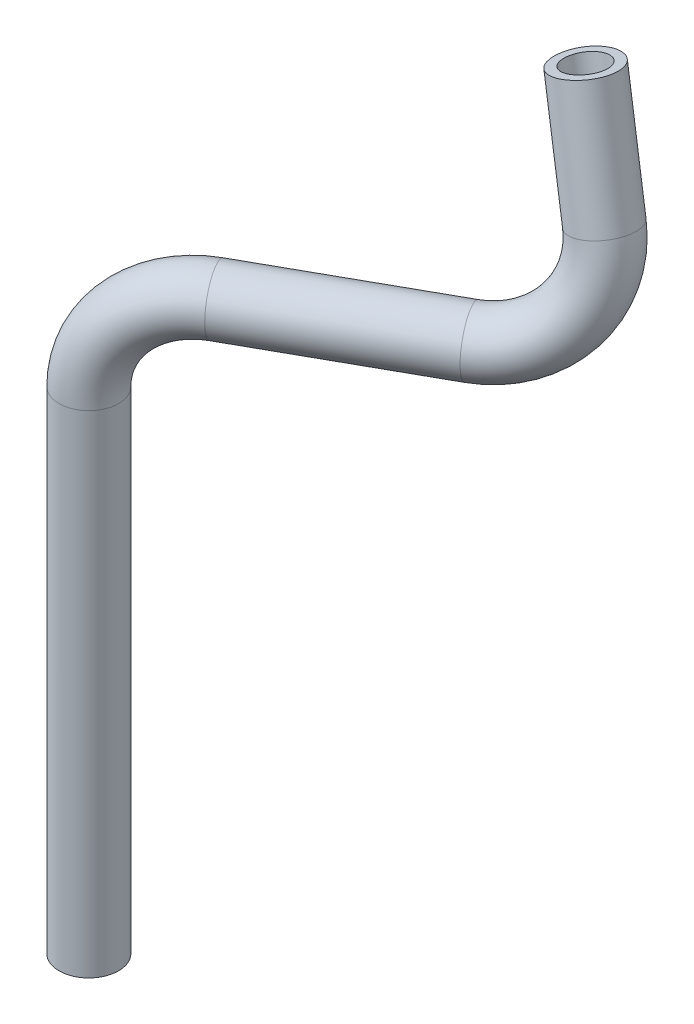
ISO-10303-21;
HEADER;
FILE_DESCRIPTION(('STEP AP214'),'2;1');
FILE_NAME('part.step','',(''),(''),'','','');
FILE_SCHEMA(('AUTOMOTIVE_DESIGN { 1 0 10303 214 1 1 1 1 }'));
ENDSEC;
DATA;
#1=APPLICATION_CONTEXT('core data for automotive mechanical design processes');
#2=APPLICATION_PROTOCOL_DEFINITION('international standard','automotive_design',2000,#1);
#3=PRODUCT_CONTEXT('',#1,'mechanical');
#4=PRODUCT('Part','Part','',(#3));
#5=PRODUCT_RELATED_PRODUCT_CATEGORY('part','',(#4));
#6=PRODUCT_DEFINITION_FORMATION('','',#4);
#7=PRODUCT_DEFINITION_CONTEXT('part definition',#1,'design');
#8=PRODUCT_DEFINITION('design','',#6,#7);
#9=PRODUCT_DEFINITION_SHAPE('','',#8);
#10=(LENGTH_UNIT() NAMED_UNIT(*) SI_UNIT(.MILLI.,.METRE.));
#11=(NAMED_UNIT(*) PLANE_ANGLE_UNIT() SI_UNIT($,.RADIAN.));
#12=(NAMED_UNIT(*) SI_UNIT($,.STERADIAN.) SOLID_ANGLE_UNIT());
#13=UNCERTAINTY_MEASURE_WITH_UNIT(LENGTH_MEASURE(1.E-05),#10,'distance_accuracy_value','');
#14=(GEOMETRIC_REPRESENTATION_CONTEXT(3) GLOBAL_UNCERTAINTY_ASSIGNED_CONTEXT((#13)) GLOBAL_UNIT_ASSIGNED_CONTEXT((#10,
#11,#12)) REPRESENTATION_CONTEXT('',''));
#15=CARTESIAN_POINT('',(0.,0.,0.));
#16=DIRECTION('',(0.,0.,1.));
#17=DIRECTION('',(1.,0.,0.));
#18=AXIS2_PLACEMENT_3D('',#15,#16,#17);
#19=CARTESIAN_POINT('',(-2.22044604925031E-13,0.,0.));
#20=DIRECTION('',(0.,-1.,0.));
#21=DIRECTION('',(0.981862774250405,0.,0.189592965431999));
#22=AXIS2_PLACEMENT_3D('',#19,#20,#21);
#23=PLANE('',#22);
#24=CARTESIAN_POINT('',(-2.19537750383587E-13,0.,0.));
#25=DIRECTION('',(0.,-1.,0.));
#26=DIRECTION('',(0.,0.,-1.));
#27=AXIS2_PLACEMENT_3D('',#24,#25,#26);
#28=CIRCLE('',#27,2.175);
#29=CARTESIAN_POINT('',(-2.19537750383587E-13,0.,-2.17500000000001));
#30=VERTEX_POINT('',#29);
#31=EDGE_CURVE('E67',#30,#30,#28,.T.);
#32=ORIENTED_EDGE('',*,*,#31,.F.);
#33=EDGE_LOOP('',(#32));
#34=FACE_BOUND('',#33,.T.);
#35=CARTESIAN_POINT('',(-2.22044604925031E-13,0.,0.));
#36=DIRECTION('',(0.,-1.,0.));
#37=DIRECTION('',(0.981862774250405,0.,0.189592965431999));
#38=AXIS2_PLACEMENT_3D('',#35,#36,#37);
#39=CIRCLE('',#38,3.175);
#40=CARTESIAN_POINT('',(3.11741430824481,0.,0.60195766524659));
#41=VERTEX_POINT('',#40);
#42=EDGE_CURVE('E11',#41,#41,#39,.T.);
#43=ORIENTED_EDGE('',*,*,#42,.T.);
#44=EDGE_LOOP('',(#43));
#45=FACE_BOUND('',#44,.T.);
#46=ADVANCED_FACE('F45',(#34,#45),#23,.T.);
#47=CARTESIAN_POINT('',(32.0912843493026,81.9487271445281,-21.7300962858045));
#48=DIRECTION('',(0.219779218999893,-0.973167297783081,0.0681359334079606));
#49=DIRECTION('',(0.97543416101534,0.220291165334198,0.));
#50=AXIS2_PLACEMENT_3D('',#47,#48,#49);
#51=CYLINDRICAL_SURFACE('',#50,3.175);
#52=CARTESIAN_POINT('',(33.9076141098866,73.9061436235111,-21.1669978992636));
#53=DIRECTION('',(0.219779218999892,-0.973167297783081,0.0681359334079604));
#54=DIRECTION('',(0.975434161015341,0.220291165334197,0.));
#55=AXIS2_PLACEMENT_3D('',#52,#53,#54);
#56=CIRCLE('',#55,3.175);
#57=CARTESIAN_POINT('',(36.6033566039685,74.4027721533916,-22.7691706455398));
#58=VERTEX_POINT('',#57);
#59=EDGE_CURVE('E64',#58,#58,#56,.T.);
#60=ORIENTED_EDGE('',*,*,#59,.F.);
#61=EDGE_LOOP('',(#60));
#62=FACE_BOUND('',#61,.T.);
#63=CARTESIAN_POINT('',(34.0945263593937,87.4912522327395,-22.0691841110215));
#64=CARTESIAN_POINT('',(34.0911567873665,87.5061368556718,-21.8914286797788));
#65=CARTESIAN_POINT('',(34.0729976379843,87.5181099839496,-21.7135811977549));
#66=CARTESIAN_POINT('',(34.0076185561973,87.5355846065078,-21.3628317135187));
#67=CARTESIAN_POINT('',(33.9603639538796,87.541078357209,-21.1899358692418));
#68=CARTESIAN_POINT('',(33.8382169119769,87.5450954957041,-20.8541886776084));
#69=CARTESIAN_POINT('',(33.7633376723639,87.5436222086136,-20.6913325762344));
#70=CARTESIAN_POINT('',(33.5881513488829,87.5334306219162,-20.3802315851133));
#71=CARTESIAN_POINT('',(33.4878505691276,87.5247141172856,-20.231983085567));
#72=CARTESIAN_POINT('',(33.2647101434814,87.5000001530473,-19.9542264063674));
#73=CARTESIAN_POINT('',(33.1418693084137,87.4840023092221,-19.8247192161205));
#74=CARTESIAN_POINT('',(32.8771800023946,87.4449636811502,-19.5881213152766));
#75=CARTESIAN_POINT('',(32.7353309018781,87.421922663597,-19.4810313474527));
#76=CARTESIAN_POINT('',(32.4368169043125,87.3693556284119,-19.2923967078863));
#77=CARTESIAN_POINT('',(32.2801648971161,87.3398352237047,-19.2108300733831));
#78=CARTESIAN_POINT('',(31.9563955943367,87.2751249735461,-19.0754339274941));
#79=CARTESIAN_POINT('',(31.7892783456866,87.2399351535188,-19.0216042917279));
#80=CARTESIAN_POINT('',(31.449368484408,87.1649974125386,-18.9432280720498));
#81=CARTESIAN_POINT('',(31.2765780404005,87.1252512191454,-18.9186704295822));
#82=CARTESIAN_POINT('',(30.9301161569372,87.0425119867048,-18.8995034609477));
#83=CARTESIAN_POINT('',(30.7564447149706,86.9995189383992,-18.9048942201798));
#84=CARTESIAN_POINT('',(30.4129588913699,86.9117439957815,-18.9454974443186));
#85=CARTESIAN_POINT('',(30.2431472000222,86.8669609103549,-18.9807300921008));
#86=CARTESIAN_POINT('',(29.9122374776483,86.7772174943603,-19.0800648942893));
#87=CARTESIAN_POINT('',(29.75113949597,86.7322571627902,-19.1441672121726));
#88=CARTESIAN_POINT('',(29.4420390671831,86.6437283404495,-19.2995041188733));
#89=CARTESIAN_POINT('',(29.2940455831864,86.6001608151367,-19.3907570947961));
#90=CARTESIAN_POINT('',(29.0154104278531,86.5159863638337,-19.5978168401361));
#91=CARTESIAN_POINT('',(28.8847687032362,86.4753794287529,-19.7136235341556));
#92=CARTESIAN_POINT('',(28.6445431507196,86.3985345038414,-19.9664764234685));
#93=CARTESIAN_POINT('',(28.5349513834088,86.3622948687256,-20.1035145755225));
#94=CARTESIAN_POINT('',(28.3398499519176,86.2953494807288,-20.3949815956667));
#95=CARTESIAN_POINT('',(28.254340151575,86.2646436965593,-20.5494103654216));
#96=CARTESIAN_POINT('',(28.109886914459,86.2097095868623,-20.8711337792574));
#97=CARTESIAN_POINT('',(28.0509210534696,86.1854758008832,-21.0384174231775));
#98=CARTESIAN_POINT('',(27.9611352339654,86.144075237742,-21.3812099074512));
#99=CARTESIAN_POINT('',(27.9303152781044,86.1269084612462,-21.5567187485802));
#100=CARTESIAN_POINT('',(27.8977266838811,86.0999608957495,-21.910971206494));
#101=CARTESIAN_POINT('',(27.8959582532913,86.090180159573,-22.0897148464044));
#102=CARTESIAN_POINT('',(27.9215723920781,86.0780298015938,-22.4453559313768));
#103=CARTESIAN_POINT('',(27.948955131892,86.0756602231221,-22.6222533656386));
#104=CARTESIAN_POINT('',(28.0321970622588,86.0780934360554,-22.9693242617059));
#105=CARTESIAN_POINT('',(28.088080421601,86.0829023215446,-23.139491884381));
#106=CARTESIAN_POINT('',(28.2268276460043,86.0992397307249,-23.4681016855955));
#107=CARTESIAN_POINT('',(28.309691573595,86.1107682699894,-23.6265438369593));
#108=CARTESIAN_POINT('',(28.5001615767067,86.1399127666608,-23.927244802472));
#109=CARTESIAN_POINT('',(28.6077767032574,86.1575309521202,-24.0694976680002));
#110=CARTESIAN_POINT('',(28.844741685099,86.1980936423351,-24.3336911344503));
#111=CARTESIAN_POINT('',(28.9740914455361,86.2210381238458,-24.4556318240136));
#112=CARTESIAN_POINT('',(29.2507986060057,86.2714037173712,-24.6756411964378));
#113=CARTESIAN_POINT('',(29.3981435776896,86.2988217440905,-24.7737262166679));
#114=CARTESIAN_POINT('',(29.7067432347042,86.3572862766192,-24.943335943105));
#115=CARTESIAN_POINT('',(29.8679978428198,86.3883327622867,-25.0148607967411));
#116=CARTESIAN_POINT('',(30.1997145448838,86.4531787208199,-25.129282402073));
#117=CARTESIAN_POINT('',(30.3701704161291,86.4869763407929,-25.1721982458698));
#118=CARTESIAN_POINT('',(30.7155216150152,86.5565182465114,-25.2282762910284));
#119=CARTESIAN_POINT('',(30.8904169627229,86.592262541057,-25.2414383578752));
#120=CARTESIAN_POINT('',(31.2397084103149,86.6649243164607,-25.2376581183166));
#121=CARTESIAN_POINT('',(31.4141042885079,86.7018422501148,-25.2207040510596));
#122=CARTESIAN_POINT('',(31.7573262492633,86.7760840761416,-25.1571751831783));
#123=CARTESIAN_POINT('',(31.9261522892028,86.813407971618,-25.1106001559364));
#124=CARTESIAN_POINT('',(32.2535260156477,86.8877618437551,-24.9891189117273));
#125=CARTESIAN_POINT('',(32.4120647425889,86.9247915401996,-24.9141883769033));
#126=CARTESIAN_POINT('',(32.7141317762447,86.9977948864262,-24.7381460105728));
#127=CARTESIAN_POINT('',(32.8576606623454,87.033768576932,-24.6370351901605));
#128=CARTESIAN_POINT('',(33.1255594073866,87.1039176510492,-24.4115289331186));
#129=CARTESIAN_POINT('',(33.2499316449144,87.1380932575723,-24.287136391522));
#130=CARTESIAN_POINT('',(33.4759809491972,87.2038981270453,-24.0185623252401));
#131=CARTESIAN_POINT('',(33.5776526055916,87.2355267818195,-23.8743760962058));
#132=CARTESIAN_POINT('',(33.7553040455715,87.295428567885,-23.5704262311606));
#133=CARTESIAN_POINT('',(33.8312936595488,87.3237029803939,-23.4106685857045));
#134=CARTESIAN_POINT('',(33.9554053067559,87.3760901522151,-23.0801851259243));
#135=CARTESIAN_POINT('',(34.0035602450854,87.4002078017149,-22.9094725285944));
#136=CARTESIAN_POINT('',(34.0583527308327,87.4354983502445,-22.626280633167));
#137=CARTESIAN_POINT('',(34.0737574206657,87.4481606618429,-22.5156038680816));
#138=CARTESIAN_POINT('',(34.0929051982576,87.4713509246311,-22.2930249398219));
#139=CARTESIAN_POINT('',(34.0966482939903,87.4818788772802,-22.1811227774857));
#140=CARTESIAN_POINT('',(34.0945263593937,87.4912522327395,-22.0691841110215));
#141=B_SPLINE_CURVE_WITH_KNOTS('',3,(#63,#64,#65,#66,#67,#68,#69,#70,#71,#72,#73,#74,#75,#76,
#77,#78,#79,#80,#81,#82,#83,#84,#85,#86,#87,#88,#89,#90,#91,#92,#93,#94,#95,#96,#97,#98,#99,
#100,#101,#102,#103,#104,#105,#106,#107,#108,#109,#110,#111,#112,#113,#114,#115,#116,#117,#118,
#119,#120,#121,#122,#123,#124,#125,#126,#127,#128,#129,#130,#131,#132,#133,#134,#135,#136,#137,
#138,#139,#140),.UNSPECIFIED.,.T.,.F.,(4,2,2,2,2,2,2,2,2,2,2,2,2,2,2,2,2,2,2,2,2,2,2,2,2,2,2,2,
2,2,2,2,2,2,2,2,2,2,4),(0.,0.534818019808254,1.07027456121159,1.60547557433587,2.140543996283,
2.67564065569527,3.21075504221285,3.7454076898456,4.28005793992585,4.81450614242856,
5.34895586893202,5.88376734711921,6.41858185375935,6.95375937777974,7.48893525844452,
8.02390888877468,8.55887949424317,9.09339730657504,9.62791516930454,10.1624368548277,
10.6969616655406,11.2319405138155,11.7669206019524,12.3020966337715,12.8372703300483,
13.3720764782068,13.9068796577412,14.4413255804114,14.9757739192704,15.5104310149856,
16.04509220119,16.5802129590818,17.1153130534585,17.6503466534212,18.1855076352326,
18.7204635392651,19.2547857384364,19.5915791430271,19.9283723173331),.UNSPECIFIED.);
#142=CARTESIAN_POINT('',(34.0945263593937,87.4912522327395,-22.0691841110215));
#143=VERTEX_POINT('',#142);
#144=EDGE_CURVE('E90',#143,#143,#141,.T.);
#145=ORIENTED_EDGE('',*,*,#144,.T.);
#146=EDGE_LOOP('',(#145));
#147=FACE_BOUND('',#146,.T.);
#148=ADVANCED_FACE('F123',(#62,#147),#51,.T.);
#149=CARTESIAN_POINT('',(25.4170865694713,72.3419592774307,-16.1207845251656));
#150=DIRECTION('',(-0.480423267286548,-0.168756285335828,-0.860647895721224));
#151=DIRECTION('',(-0.873171082284387,0.,0.487413849887662));
#152=AXIS2_PLACEMENT_3D('',#149,#150,#151);
#153=TOROIDAL_SURFACE('',#152,10.,3.175);
#154=CARTESIAN_POINT('',(26.239628076754,62.4853811888664,-14.6472534420759));
#155=DIRECTION('',(-0.873171082284388,0.,0.487413849887661));
#156=DIRECTION('',(0.313953306155402,-0.764923944054147,0.562427489874687));
#157=AXIS2_PLACEMENT_3D('',#154,#155,#156);
#158=CIRCLE('',#157,3.175);
#159=CARTESIAN_POINT('',(26.5007850053163,59.3559176457473,-14.1794073231949));
#160=VERTEX_POINT('',#159);
#161=EDGE_CURVE('E59',#160,#160,#158,.T.);
#162=CARTESIAN_POINT('',(25.4170865694713,72.3419592774307,-16.1207845251656));
#163=DIRECTION('',(-0.480423267286548,-0.168756285335828,-0.860647895721224));
#164=DIRECTION('',(-0.873171082284387,0.,0.487413849887662));
#165=AXIS2_PLACEMENT_3D('',#162,#163,#164);
#166=CIRCLE('',#165,13.175);
#167=EDGE_CURVE('',#58,#160,#166,.T.);
#168=ORIENTED_EDGE('',*,*,#59,.T.);
#169=ORIENTED_EDGE('',*,*,#161,.F.);
#170=ORIENTED_EDGE('',*,*,#167,.T.);
#171=ORIENTED_EDGE('',*,*,#167,.F.);
#172=EDGE_LOOP('',(#168,#170,#169,#171));
#173=FACE_BOUND('',#172,.T.);
#174=ADVANCED_FACE('F126',(#173),#153,.T.);
#175=CARTESIAN_POINT('',(26.2396280767541,62.4853811888664,-14.6472534420759));
#176=DIRECTION('',(-0.873171082284387,0.,0.487413849887662));
#177=DIRECTION('',(0.487413849887662,0.,0.873171082284387));
#178=AXIS2_PLACEMENT_3D('',#175,#176,#177);
#179=CYLINDRICAL_SURFACE('',#178,3.175);
#180=CARTESIAN_POINT('',(8.73171082284388,62.4853811888664,-4.87413849887663));
#181=DIRECTION('',(-0.873171082284388,0.,0.487413849887661));
#182=DIRECTION('',(0.313953306155402,-0.764923944054147,0.562427489874687));
#183=AXIS2_PLACEMENT_3D('',#180,#181,#182);
#184=CIRCLE('',#183,3.175);
#185=CARTESIAN_POINT('',(8.73171082284389,65.6603811888664,-4.87413849887663));
#186=VERTEX_POINT('',#185);
#187=EDGE_CURVE('E55',#186,#186,#184,.T.);
#188=ORIENTED_EDGE('',*,*,#187,.F.);
#189=EDGE_LOOP('',(#188));
#190=FACE_BOUND('',#189,.T.);
#191=ORIENTED_EDGE('',*,*,#161,.T.);
#192=EDGE_LOOP('',(#191));
#193=FACE_BOUND('',#192,.T.);
#194=ADVANCED_FACE('F130',(#190,#193),#179,.T.);
#195=CARTESIAN_POINT('',(8.73171082284387,52.4853811888664,-4.87413849887663));
#196=DIRECTION('',(0.487413849887662,0.,0.873171082284387));
#197=DIRECTION('',(0.873171082284387,0.,-0.487413849887662));
#198=AXIS2_PLACEMENT_3D('',#195,#196,#197);
#199=TOROIDAL_SURFACE('',#198,9.99999999999999,3.175);
#200=CARTESIAN_POINT('',(0.,52.4853811888665,0.));
#201=DIRECTION('',(0.,-1.,0.));
#202=DIRECTION('',(0.981862774250405,0.,0.189592965431999));
#203=AXIS2_PLACEMENT_3D('',#200,#201,#202);
#204=CIRCLE('',#203,3.175);
#205=CARTESIAN_POINT('',(-2.77231818625293,52.4853811888665,1.54753897339332));
#206=VERTEX_POINT('',#205);
#207=EDGE_CURVE('E51',#206,#206,#204,.T.);
#208=CARTESIAN_POINT('',(8.73171082284387,52.4853811888664,-4.87413849887663));
#209=DIRECTION('',(0.487413849887662,0.,0.873171082284387));
#210=DIRECTION('',(0.873171082284387,0.,-0.487413849887662));
#211=AXIS2_PLACEMENT_3D('',#208,#209,#210);
#212=CIRCLE('',#211,13.175);
#213=EDGE_CURVE('',#186,#206,#212,.T.);
#214=ORIENTED_EDGE('',*,*,#187,.T.);
#215=ORIENTED_EDGE('',*,*,#207,.F.);
#216=ORIENTED_EDGE('',*,*,#213,.T.);
#217=ORIENTED_EDGE('',*,*,#213,.F.);
#218=EDGE_LOOP('',(#214,#216,#215,#217));
#219=FACE_BOUND('',#218,.T.);
#220=ADVANCED_FACE('F134',(#219),#199,.T.);
#221=CARTESIAN_POINT('',(0.,52.4853811888664,0.));
#222=DIRECTION('',(0.,-1.,0.));
#223=DIRECTION('',(0.,0.,-1.));
#224=AXIS2_PLACEMENT_3D('',#221,#222,#223);
#225=CYLINDRICAL_SURFACE('',#224,3.175);
#226=ORIENTED_EDGE('',*,*,#207,.T.);
#227=EDGE_LOOP('',(#226));
#228=FACE_BOUND('',#227,.T.);
#229=ORIENTED_EDGE('',*,*,#42,.F.);
#230=EDGE_LOOP('',(#229));
#231=FACE_BOUND('',#230,.T.);
#232=ADVANCED_FACE('F107',(#228,#231),#225,.T.);
#233=CARTESIAN_POINT('',(32.0912843493026,81.9487271445281,-21.7300962858045));
#234=DIRECTION('',(0.219779218999893,-0.973167297783081,0.0681359334079606));
#235=DIRECTION('',(0.97543416101534,0.220291165334198,0.));
#236=AXIS2_PLACEMENT_3D('',#233,#234,#235);
#237=CYLINDRICAL_SURFACE('',#236,2.175);
#238=CARTESIAN_POINT('',(33.9076141098866,73.9061436235111,-21.1669978992636));
#239=DIRECTION('',(-0.219779218999893,0.973167297783081,-0.0681359334079612));
#240=DIRECTION('',(-0.97543416101534,-0.220291165334198,0.));
#241=AXIS2_PLACEMENT_3D('',#238,#239,#240);
#242=CIRCLE('',#241,2.175);
#243=CARTESIAN_POINT('',(35.754303849927,74.2463537187836,-22.2645493081299));
#244=VERTEX_POINT('',#243);
#245=EDGE_CURVE('E79',#244,#244,#242,.F.);
#246=ORIENTED_EDGE('',*,*,#245,.T.);
#247=EDGE_LOOP('',(#246));
#248=FACE_BOUND('',#247,.T.);
#249=CARTESIAN_POINT('',(33.1125082644861,87.30011427481,-22.0712252616056));
#250=CARTESIAN_POINT('',(33.1103480258673,87.3096551625311,-21.9494248466295));
#251=CARTESIAN_POINT('',(33.098078189797,87.3171160321001,-21.8275520681655));
#252=CARTESIAN_POINT('',(33.0536532766991,87.3275159962488,-21.5871834850598));
#253=CARTESIAN_POINT('',(33.0214743655696,87.3304496563598,-21.4686919063396));
#254=CARTESIAN_POINT('',(32.9381844680074,87.3315479667611,-21.238588735051));
#255=CARTESIAN_POINT('',(32.8870825244417,87.3297148924446,-21.1269738859247));
#256=CARTESIAN_POINT('',(32.7674415216743,87.3211846516723,-20.9137613386383));
#257=CARTESIAN_POINT('',(32.6989067923796,87.3144886922813,-20.8121611617436));
#258=CARTESIAN_POINT('',(32.5463610065017,87.2962899618673,-20.6218089835161));
#259=CARTESIAN_POINT('',(32.4623487051338,87.2847868041306,-20.5330580166078));
#260=CARTESIAN_POINT('',(32.2812545029341,87.2571987805552,-20.3709269985717));
#261=CARTESIAN_POINT('',(32.1841721266714,87.2411137480245,-20.2975475068378));
#262=CARTESIAN_POINT('',(31.9797531574188,87.2047703933879,-20.1682726563058));
#263=CARTESIAN_POINT('',(31.8724208359034,87.1845138056655,-20.1123700554867));
#264=CARTESIAN_POINT('',(31.6505176119143,87.1403930220512,-20.0195951147102));
#265=CARTESIAN_POINT('',(31.535946732426,87.1165288376145,-19.9827227143275));
#266=CARTESIAN_POINT('',(31.3028300790341,87.0659207146451,-19.9290614971749));
#267=CARTESIAN_POINT('',(31.1842850106466,87.0391772854044,-19.9122691349115));
#268=CARTESIAN_POINT('',(30.9465432125539,86.9836576341404,-19.8992365140685));
#269=CARTESIAN_POINT('',(30.8273464825945,86.9548814113239,-19.9029962635081));
#270=CARTESIAN_POINT('',(30.5916139432337,86.8962298634265,-19.9309724346756));
#271=CARTESIAN_POINT('',(30.4750789924086,86.8663541916028,-19.9551953638592));
#272=CARTESIAN_POINT('',(30.2479791691718,86.8065080050221,-20.0234290068154));
#273=CARTESIAN_POINT('',(30.1374143159429,86.7765374899607,-20.067439784165));
#274=CARTESIAN_POINT('',(29.9253209574889,86.717495143135,-20.174029693673));
#275=CARTESIAN_POINT('',(29.823795338617,86.6884236003455,-20.2366147294034));
#276=CARTESIAN_POINT('',(29.6326702797337,86.6321550893538,-20.3785834338771));
#277=CARTESIAN_POINT('',(29.5430708199716,86.6049581180472,-20.4579670747999));
#278=CARTESIAN_POINT('',(29.3783328354873,86.5533280563978,-20.6312733057575));
#279=CARTESIAN_POINT('',(29.3031917436122,86.5288944757197,-20.7251933094376));
#280=CARTESIAN_POINT('',(29.1694705310126,86.4835509529741,-20.9249210367855));
#281=CARTESIAN_POINT('',(29.1108903675781,86.4626410018193,-21.0307287297944));
#282=CARTESIAN_POINT('',(29.0119706646768,86.4249682117733,-21.251183418978));
#283=CARTESIAN_POINT('',(28.9716238945575,86.4082037301469,-21.3658268900785));
#284=CARTESIAN_POINT('',(28.9102880929236,86.3792569267883,-21.6007327987967));
#285=CARTESIAN_POINT('',(28.8892990617982,86.3670746051482,-21.7209952365273));
#286=CARTESIAN_POINT('',(28.8672899251273,86.3475591768979,-21.9637208641081));
#287=CARTESIAN_POINT('',(28.866269894789,86.340226088551,-22.086184062245));
#288=CARTESIAN_POINT('',(28.8842520214306,86.3304990230173,-22.3298299642852));
#289=CARTESIAN_POINT('',(28.9032542339361,86.3281050595277,-22.4510126646364));
#290=CARTESIAN_POINT('',(28.9607848244085,86.3281801179694,-22.6887005974818));
#291=CARTESIAN_POINT('',(28.9993209813086,86.3306510783734,-22.8052039465717));
#292=CARTESIAN_POINT('',(29.0948654615707,86.3402360053688,-23.0301676391661));
#293=CARTESIAN_POINT('',(29.1518738036178,86.3473499766567,-23.1386279745348));
#294=CARTESIAN_POINT('',(29.2827913842383,86.3658746938119,-23.3444362559369));
#295=CARTESIAN_POINT('',(29.3567035144698,86.377286175052,-23.4417822964194));
#296=CARTESIAN_POINT('',(29.5193544636036,86.403959725383,-23.6225668507764));
#297=CARTESIAN_POINT('',(29.6080932553257,86.4192217874151,-23.7060053901457));
#298=CARTESIAN_POINT('',(29.7978666729976,86.4530729490204,-23.8565729083836));
#299=CARTESIAN_POINT('',(29.8988973225526,86.4716609735615,-23.923707140722));
#300=CARTESIAN_POINT('',(30.1104164374956,86.5116019015699,-24.0397903225306));
#301=CARTESIAN_POINT('',(30.2209048729488,86.5329547962862,-24.088739329556));
#302=CARTESIAN_POINT('',(30.4481620953248,86.5778255852738,-24.1670509073942));
#303=CARTESIAN_POINT('',(30.5649289031061,86.6013427989275,-24.1964196118722));
#304=CARTESIAN_POINT('',(30.8014465258121,86.6499439990242,-24.2347681163481));
#305=CARTESIAN_POINT('',(30.921197349954,86.6750279903071,-24.2437478533603));
#306=CARTESIAN_POINT('',(31.1602842858779,86.726162049128,-24.24107317741));
#307=CARTESIAN_POINT('',(31.2796203176125,86.7522122929202,-24.2294149815817));
#308=CARTESIAN_POINT('',(31.5144418434167,86.8046729708955,-24.185799140399));
#309=CARTESIAN_POINT('',(31.6299273195521,86.8310834067554,-24.1538414005123));
#310=CARTESIAN_POINT('',(31.8537864246631,86.8836790843637,-24.0705261332443));
#311=CARTESIAN_POINT('',(31.9621570960847,86.9098642285795,-24.01916059742));
#312=CARTESIAN_POINT('',(32.1686217167771,86.9614051265181,-23.8984996811486));
#313=CARTESIAN_POINT('',(32.2667160663589,86.986760912522,-23.8292049994909));
#314=CARTESIAN_POINT('',(32.449807573976,87.0360534005414,-23.6746687577813));
#315=CARTESIAN_POINT('',(32.534806241333,87.0599902658964,-23.5894290379598));
#316=CARTESIAN_POINT('',(32.6893022371878,87.1058724632566,-23.4053958180786));
#317=CARTESIAN_POINT('',(32.7587957838831,87.1278173086222,-23.3065990208263));
#318=CARTESIAN_POINT('',(32.8802697180346,87.1691382164321,-23.0982863434097));
#319=CARTESIAN_POINT('',(32.9322488182841,87.1885140900089,-22.9887696761622));
#320=CARTESIAN_POINT('',(33.0171624694991,87.2241314953909,-22.7622140635493));
#321=CARTESIAN_POINT('',(33.0501196915195,87.240376742951,-22.6451842583695));
#322=CARTESIAN_POINT('',(33.0875714867035,87.2638550518075,-22.451386240558));
#323=CARTESIAN_POINT('',(33.0980955923792,87.2721908516976,-22.3758618000189));
#324=CARTESIAN_POINT('',(33.111241399339,87.2873285794074,-22.2239761479));
#325=CARTESIAN_POINT('',(33.1138631032691,87.2941305077405,-22.1476149366004));
#326=CARTESIAN_POINT('',(33.1125082644861,87.30011427481,-22.0712252616056));
#327=B_SPLINE_CURVE_WITH_KNOTS('',3,(#249,#250,#251,#252,#253,#254,#255,#256,#257,#258,#259,
#260,#261,#262,#263,#264,#265,#266,#267,#268,#269,#270,#271,#272,#273,#274,#275,#276,#277,#278,
#279,#280,#281,#282,#283,#284,#285,#286,#287,#288,#289,#290,#291,#292,#293,#294,#295,#296,#297,
#298,#299,#300,#301,#302,#303,#304,#305,#306,#307,#308,#309,#310,#311,#312,#313,#314,#315,#316,
#317,#318,#319,#320,#321,#322,#323,#324,#325,#326),.UNSPECIFIED.,.T.,.F.,(4,2,2,2,2,2,2,2,2,2,2,
2,2,2,2,2,2,2,2,2,2,2,2,2,2,2,2,2,2,2,2,2,2,2,2,2,2,2,4),(0.,0.366298145866473,
0.733035655461647,1.09959813562334,1.46606965876347,1.83257066827368,2.19908501305431,
2.56544728081351,2.9318083852838,3.29810479252758,3.66440134269714,4.03081442198491,
4.39722867853884,4.76375951975923,5.13028975396362,5.49675484878149,5.86321899849272,
6.22953769501656,6.5958563989036,6.96217648242042,7.32849758181779,7.69496467470179,
8.0614321382768,8.42796233880867,8.79449186742376,9.16090313807596,9.52731324904682,
9.89360852551841,10.2599049335504,10.6262684894726,10.992633751513,11.3591503560998,
11.7256526778339,12.0921127272908,12.4586620613311,12.8252383286775,13.1913767883636,
13.4211084004326,13.6508399355789),.UNSPECIFIED.);
#328=CARTESIAN_POINT('',(33.1125082644861,87.30011427481,-22.0712252616056));
#329=VERTEX_POINT('',#328);
#330=EDGE_CURVE('E82',#329,#329,#327,.T.);
#331=ORIENTED_EDGE('',*,*,#330,.F.);
#332=EDGE_LOOP('',(#331));
#333=FACE_BOUND('',#332,.T.);
#334=ADVANCED_FACE('F102',(#248,#333),#237,.F.);
#335=CARTESIAN_POINT('',(25.4170865694713,72.3419592774307,-16.1207845251656));
#336=DIRECTION('',(-0.480423267286548,-0.168756285335828,-0.860647895721224));
#337=DIRECTION('',(-0.873171082284387,0.,0.487413849887662));
#338=AXIS2_PLACEMENT_3D('',#335,#336,#337);
#339=TOROIDAL_SURFACE('',#338,10.,2.175);
#340=CARTESIAN_POINT('',(26.239628076754,62.4853811888664,-14.6472534420759));
#341=DIRECTION('',(-0.873171082284387,0.,0.487413849887662));
#342=DIRECTION('',(0.487413849887662,0.,0.873171082284387));
#343=AXIS2_PLACEMENT_3D('',#340,#341,#342);
#344=CIRCLE('',#343,2.175);
#345=CARTESIAN_POINT('',(26.418530854588,60.3415754546037,-14.3267604315038));
#346=VERTEX_POINT('',#345);
#347=EDGE_CURVE('E76',#346,#346,#344,.T.);
#348=CARTESIAN_POINT('',(25.4170865694713,72.3419592774307,-16.1207845251656));
#349=DIRECTION('',(-0.480423267286548,-0.168756285335828,-0.860647895721224));
#350=DIRECTION('',(-0.873171082284387,0.,0.487413849887662));
#351=AXIS2_PLACEMENT_3D('',#348,#349,#350);
#352=CIRCLE('',#351,12.175);
#353=EDGE_CURVE('',#244,#346,#352,.T.);
#354=ORIENTED_EDGE('',*,*,#245,.F.);
#355=ORIENTED_EDGE('',*,*,#347,.T.);
#356=ORIENTED_EDGE('',*,*,#353,.T.);
#357=ORIENTED_EDGE('',*,*,#353,.F.);
#358=EDGE_LOOP('',(#354,#356,#355,#357));
#359=FACE_BOUND('',#358,.T.);
#360=ADVANCED_FACE('F106',(#359),#339,.F.);
#361=CARTESIAN_POINT('',(26.2396280767541,62.4853811888664,-14.6472534420759));
#362=DIRECTION('',(-0.873171082284387,0.,0.487413849887662));
#363=DIRECTION('',(0.487413849887662,0.,0.873171082284387));
#364=AXIS2_PLACEMENT_3D('',#361,#362,#363);
#365=CYLINDRICAL_SURFACE('',#364,2.175);
#366=CARTESIAN_POINT('',(8.73171082284388,62.4853811888664,-4.87413849887663));
#367=DIRECTION('',(0.873171082284387,0.,-0.487413849887662));
#368=DIRECTION('',(-0.487413849887662,0.,-0.873171082284387));
#369=AXIS2_PLACEMENT_3D('',#366,#367,#368);
#370=CIRCLE('',#369,2.175);
#371=CARTESIAN_POINT('',(8.73171082284388,64.6603811888664,-4.87413849887664));
#372=VERTEX_POINT('',#371);
#373=EDGE_CURVE('E73',#372,#372,#370,.F.);
#374=ORIENTED_EDGE('',*,*,#373,.T.);
#375=EDGE_LOOP('',(#374));
#376=FACE_BOUND('',#375,.T.);
#377=ORIENTED_EDGE('',*,*,#347,.F.);
#378=EDGE_LOOP('',(#377));
#379=FACE_BOUND('',#378,.T.);
#380=ADVANCED_FACE('F111',(#376,#379),#365,.F.);
#381=CARTESIAN_POINT('',(8.73171082284387,52.4853811888664,-4.87413849887663));
#382=DIRECTION('',(0.487413849887662,0.,0.873171082284387));
#383=DIRECTION('',(0.873171082284387,0.,-0.487413849887662));
#384=AXIS2_PLACEMENT_3D('',#381,#382,#383);
#385=TOROIDAL_SURFACE('',#384,9.99999999999999,2.175);
#386=CARTESIAN_POINT('',(0.,52.4853811888665,0.));
#387=DIRECTION('',(0.,-1.,0.));
#388=DIRECTION('',(0.,0.,-1.));
#389=AXIS2_PLACEMENT_3D('',#386,#387,#388);
#390=CIRCLE('',#389,2.175);
#391=CARTESIAN_POINT('',(-1.89914710396854,52.4853811888665,1.06012512350565));
#392=VERTEX_POINT('',#391);
#393=EDGE_CURVE('E70',#392,#392,#390,.T.);
#394=CARTESIAN_POINT('',(8.73171082284387,52.4853811888664,-4.87413849887663));
#395=DIRECTION('',(0.487413849887662,0.,0.873171082284387));
#396=DIRECTION('',(0.873171082284387,0.,-0.487413849887662));
#397=AXIS2_PLACEMENT_3D('',#394,#395,#396);
#398=CIRCLE('',#397,12.175);
#399=EDGE_CURVE('',#372,#392,#398,.T.);
#400=ORIENTED_EDGE('',*,*,#373,.F.);
#401=ORIENTED_EDGE('',*,*,#393,.T.);
#402=ORIENTED_EDGE('',*,*,#399,.T.);
#403=ORIENTED_EDGE('',*,*,#399,.F.);
#404=EDGE_LOOP('',(#400,#402,#401,#403));
#405=FACE_BOUND('',#404,.T.);
#406=ADVANCED_FACE('F115',(#405),#385,.F.);
#407=CARTESIAN_POINT('',(0.,52.4853811888664,0.));
#408=DIRECTION('',(0.,-1.,0.));
#409=DIRECTION('',(0.,0.,-1.));
#410=AXIS2_PLACEMENT_3D('',#407,#408,#409);
#411=CYLINDRICAL_SURFACE('',#410,2.175);
#412=ORIENTED_EDGE('',*,*,#393,.F.);
#413=EDGE_LOOP('',(#412));
#414=FACE_BOUND('',#413,.T.);
#415=ORIENTED_EDGE('',*,*,#31,.T.);
#416=EDGE_LOOP('',(#415));
#417=FACE_BOUND('',#416,.T.);
#418=ADVANCED_FACE('F100',(#414,#417),#411,.F.);
#419=CARTESIAN_POINT('',(78.3660743961085,28.6585403058553,50.7195293064546));
#420=DIRECTION('',(0.416319502429726,0.156726908876634,0.895608590808865));
#421=DIRECTION('',(0.882255726415229,0.16846983872358,-0.439593842823107));
#422=AXIS2_PLACEMENT_3D('',#419,#420,#421);
#423=CYLINDRICAL_SURFACE('',#422,72.);
#424=ORIENTED_EDGE('',*,*,#330,.T.);
#425=EDGE_LOOP('',(#424));
#426=FACE_BOUND('',#425,.T.);
#427=ORIENTED_EDGE('',*,*,#144,.F.);
#428=EDGE_LOOP('',(#427));
#429=FACE_BOUND('',#428,.T.);
#430=ADVANCED_FACE('F96',(#426,#429),#423,.T.);
#431=CLOSED_SHELL('',(#46,#148,#174,#194,#220,#232,#334,#360,#380,#406,#418,#430));
#432=MANIFOLD_SOLID_BREP('B2',#431);
#433=ADVANCED_BREP_SHAPE_REPRESENTATION('',(#18,#432),#14);
#434=SHAPE_DEFINITION_REPRESENTATION(#9,#433);
ENDSEC;
END-ISO-10303-21;
